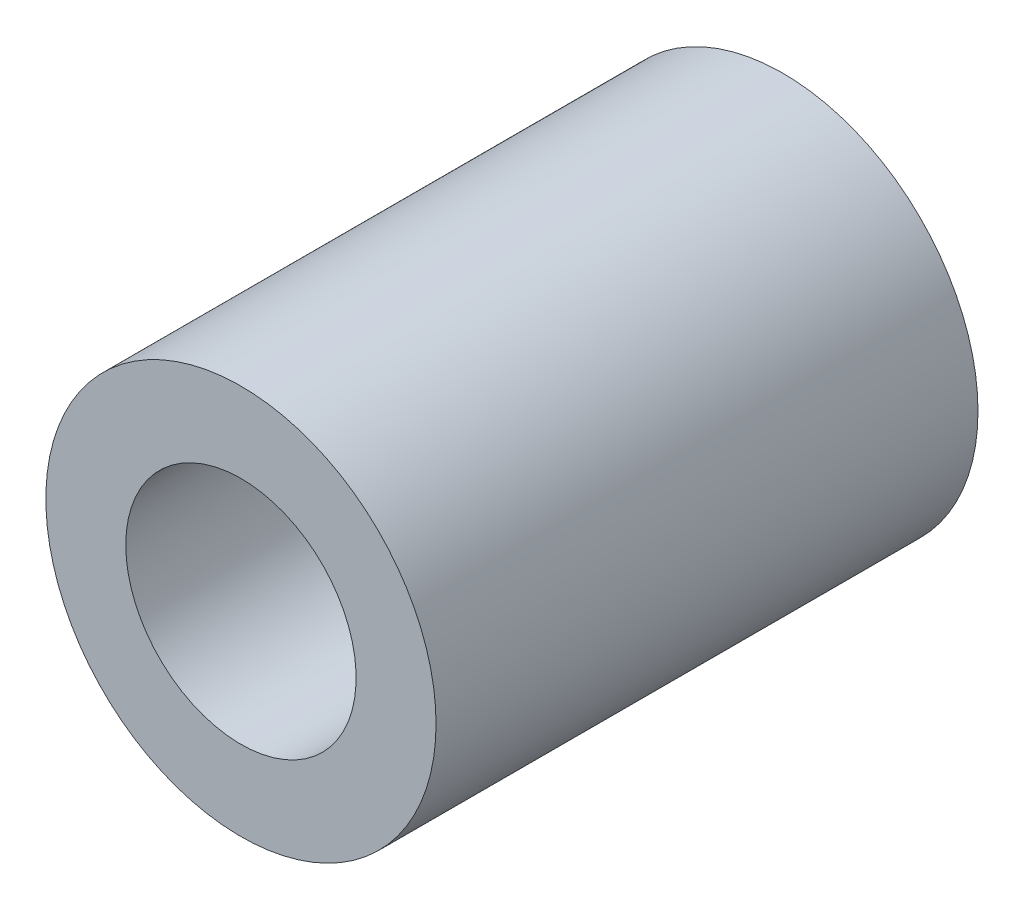
ISO-10303-21;
HEADER;
FILE_DESCRIPTION(('STEP AP214'),'2;1');
FILE_NAME('part.step','',(''),(''),'','','');
FILE_SCHEMA(('AUTOMOTIVE_DESIGN { 1 0 10303 214 1 1 1 1 }'));
ENDSEC;
DATA;
#1=APPLICATION_CONTEXT('core data for automotive mechanical design processes');
#2=APPLICATION_PROTOCOL_DEFINITION('international standard','automotive_design',2000,#1);
#3=PRODUCT_CONTEXT('',#1,'mechanical');
#4=PRODUCT('Part','Part','',(#3));
#5=PRODUCT_RELATED_PRODUCT_CATEGORY('part','',(#4));
#6=PRODUCT_DEFINITION_FORMATION('','',#4);
#7=PRODUCT_DEFINITION_CONTEXT('part definition',#1,'design');
#8=PRODUCT_DEFINITION('design','',#6,#7);
#9=PRODUCT_DEFINITION_SHAPE('','',#8);
#10=(LENGTH_UNIT() NAMED_UNIT(*) SI_UNIT(.MILLI.,.METRE.));
#11=(NAMED_UNIT(*) PLANE_ANGLE_UNIT() SI_UNIT($,.RADIAN.));
#12=(NAMED_UNIT(*) SI_UNIT($,.STERADIAN.) SOLID_ANGLE_UNIT());
#13=UNCERTAINTY_MEASURE_WITH_UNIT(LENGTH_MEASURE(1.E-05),#10,'distance_accuracy_value','');
#14=(GEOMETRIC_REPRESENTATION_CONTEXT(3) GLOBAL_UNCERTAINTY_ASSIGNED_CONTEXT((#13)) GLOBAL_UNIT_ASSIGNED_CONTEXT((#10,
#11,#12)) REPRESENTATION_CONTEXT('',''));
#15=CARTESIAN_POINT('',(0.,0.,0.));
#16=DIRECTION('',(0.,0.,1.));
#17=DIRECTION('',(1.,0.,0.));
#18=AXIS2_PLACEMENT_3D('',#15,#16,#17);
#19=CARTESIAN_POINT('',(0.,0.,10.));
#20=DIRECTION('',(0.,0.,-1.));
#21=DIRECTION('',(-1.,0.,0.));
#22=AXIS2_PLACEMENT_3D('',#19,#20,#21);
#23=CYLINDRICAL_SURFACE('',#22,3.6);
#24=CARTESIAN_POINT('',(0.,0.,10.));
#25=DIRECTION('',(0.,0.,1.));
#26=DIRECTION('',(1.,0.,0.));
#27=AXIS2_PLACEMENT_3D('',#24,#25,#26);
#28=CIRCLE('',#27,3.6);
#29=CARTESIAN_POINT('',(3.6,0.,10.));
#30=VERTEX_POINT('',#29);
#31=EDGE_CURVE('E10',#30,#30,#28,.T.);
#32=ORIENTED_EDGE('',*,*,#31,.F.);
#33=EDGE_LOOP('',(#32));
#34=FACE_BOUND('',#33,.T.);
#35=CARTESIAN_POINT('',(0.,0.,0.));
#36=DIRECTION('',(0.,0.,1.));
#37=DIRECTION('',(1.,0.,0.));
#38=AXIS2_PLACEMENT_3D('',#35,#36,#37);
#39=CIRCLE('',#38,3.6);
#40=CARTESIAN_POINT('',(3.6,0.,0.));
#41=VERTEX_POINT('',#40);
#42=EDGE_CURVE('E34',#41,#41,#39,.T.);
#43=ORIENTED_EDGE('',*,*,#42,.T.);
#44=EDGE_LOOP('',(#43));
#45=FACE_BOUND('',#44,.T.);
#46=ADVANCED_FACE('F31',(#34,#45),#23,.T.);
#47=CARTESIAN_POINT('',(0.,0.,10.));
#48=DIRECTION('',(0.,0.,1.));
#49=DIRECTION('',(1.,0.,0.));
#50=AXIS2_PLACEMENT_3D('',#47,#48,#49);
#51=PLANE('',#50);
#52=CARTESIAN_POINT('',(0.,0.,10.));
#53=DIRECTION('',(0.,0.,-1.));
#54=DIRECTION('',(-1.,0.,0.));
#55=AXIS2_PLACEMENT_3D('',#52,#53,#54);
#56=CIRCLE('',#55,2.125);
#57=CARTESIAN_POINT('',(-2.125,0.,10.));
#58=VERTEX_POINT('',#57);
#59=EDGE_CURVE('E41',#58,#58,#56,.T.);
#60=ORIENTED_EDGE('',*,*,#59,.T.);
#61=EDGE_LOOP('',(#60));
#62=FACE_BOUND('',#61,.T.);
#63=ORIENTED_EDGE('',*,*,#31,.T.);
#64=EDGE_LOOP('',(#63));
#65=FACE_BOUND('',#64,.T.);
#66=ADVANCED_FACE('F49',(#62,#65),#51,.T.);
#67=CARTESIAN_POINT('',(0.,0.,0.));
#68=DIRECTION('',(0.,0.,1.));
#69=DIRECTION('',(1.,0.,0.));
#70=AXIS2_PLACEMENT_3D('',#67,#68,#69);
#71=PLANE('',#70);
#72=CARTESIAN_POINT('',(0.,0.,0.));
#73=DIRECTION('',(0.,0.,-1.));
#74=DIRECTION('',(-1.,0.,0.));
#75=AXIS2_PLACEMENT_3D('',#72,#73,#74);
#76=CIRCLE('',#75,2.125);
#77=CARTESIAN_POINT('',(-2.125,0.,0.));
#78=VERTEX_POINT('',#77);
#79=EDGE_CURVE('E43',#78,#78,#76,.T.);
#80=ORIENTED_EDGE('',*,*,#79,.F.);
#81=EDGE_LOOP('',(#80));
#82=FACE_BOUND('',#81,.T.);
#83=ORIENTED_EDGE('',*,*,#42,.F.);
#84=EDGE_LOOP('',(#83));
#85=FACE_BOUND('',#84,.T.);
#86=ADVANCED_FACE('F54',(#82,#85),#71,.F.);
#87=CARTESIAN_POINT('',(0.,0.,10.));
#88=DIRECTION('',(0.,0.,-1.));
#89=DIRECTION('',(-1.,0.,0.));
#90=AXIS2_PLACEMENT_3D('',#87,#88,#89);
#91=CYLINDRICAL_SURFACE('',#90,2.125);
#92=ORIENTED_EDGE('',*,*,#59,.F.);
#93=EDGE_LOOP('',(#92));
#94=FACE_BOUND('',#93,.T.);
#95=ORIENTED_EDGE('',*,*,#79,.T.);
#96=EDGE_LOOP('',(#95));
#97=FACE_BOUND('',#96,.T.);
#98=ADVANCED_FACE('F51',(#94,#97),#91,.F.);
#99=CLOSED_SHELL('',(#46,#66,#86,#98));
#100=MANIFOLD_SOLID_BREP('B2',#99);
#101=ADVANCED_BREP_SHAPE_REPRESENTATION('',(#18,#100),#14);
#102=SHAPE_DEFINITION_REPRESENTATION(#9,#101);
ENDSEC;
END-ISO-10303-21;
